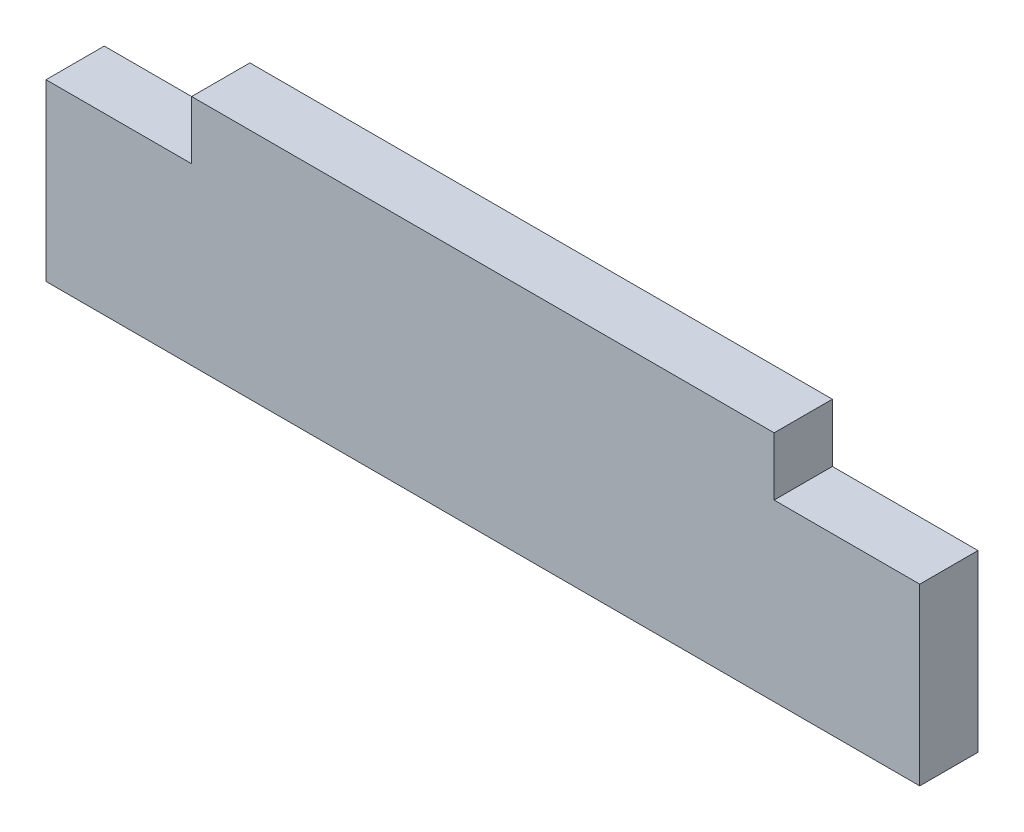
ISO-10303-21;
HEADER;
FILE_DESCRIPTION(('STEP AP214'),'2;1');
FILE_NAME('part.step','',(''),(''),'','','');
FILE_SCHEMA(('AUTOMOTIVE_DESIGN { 1 0 10303 214 1 1 1 1 }'));
ENDSEC;
DATA;
#1=APPLICATION_CONTEXT('core data for automotive mechanical design processes');
#2=APPLICATION_PROTOCOL_DEFINITION('international standard','automotive_design',2000,#1);
#3=PRODUCT_CONTEXT('',#1,'mechanical');
#4=PRODUCT('Part','Part','',(#3));
#5=PRODUCT_RELATED_PRODUCT_CATEGORY('part','',(#4));
#6=PRODUCT_DEFINITION_FORMATION('','',#4);
#7=PRODUCT_DEFINITION_CONTEXT('part definition',#1,'design');
#8=PRODUCT_DEFINITION('design','',#6,#7);
#9=PRODUCT_DEFINITION_SHAPE('','',#8);
#10=(LENGTH_UNIT() NAMED_UNIT(*) SI_UNIT(.MILLI.,.METRE.));
#11=(NAMED_UNIT(*) PLANE_ANGLE_UNIT() SI_UNIT($,.RADIAN.));
#12=(NAMED_UNIT(*) SI_UNIT($,.STERADIAN.) SOLID_ANGLE_UNIT());
#13=UNCERTAINTY_MEASURE_WITH_UNIT(LENGTH_MEASURE(1.E-05),#10,'distance_accuracy_value','');
#14=(GEOMETRIC_REPRESENTATION_CONTEXT(3) GLOBAL_UNCERTAINTY_ASSIGNED_CONTEXT((#13)) GLOBAL_UNIT_ASSIGNED_CONTEXT((#10,
#11,#12)) REPRESENTATION_CONTEXT('',''));
#15=CARTESIAN_POINT('',(0.,0.,0.));
#16=DIRECTION('',(0.,0.,1.));
#17=DIRECTION('',(1.,0.,0.));
#18=AXIS2_PLACEMENT_3D('',#15,#16,#17);
#19=CARTESIAN_POINT('',(22.5,0.,1.5));
#20=DIRECTION('',(0.,1.,0.));
#21=DIRECTION('',(-1.,0.,0.));
#22=AXIS2_PLACEMENT_3D('',#19,#20,#21);
#23=PLANE('',#22);
#24=DIRECTION('',(1.,0.,0.));
#25=VECTOR('',#24,1.);
#26=CARTESIAN_POINT('',(22.5,0.,-1.5));
#27=LINE('',#26,#25);
#28=CARTESIAN_POINT('',(-22.5,0.,-1.5));
#29=VERTEX_POINT('',#28);
#30=CARTESIAN_POINT('',(22.5,0.,-1.5));
#31=VERTEX_POINT('',#30);
#32=EDGE_CURVE('E140',#29,#31,#27,.T.);
#33=ORIENTED_EDGE('',*,*,#32,.T.);
#34=DIRECTION('',(0.,0.,-1.));
#35=VECTOR('',#34,1.);
#36=CARTESIAN_POINT('',(22.5,0.,1.5));
#37=LINE('',#36,#35);
#38=CARTESIAN_POINT('',(22.5,0.,1.5));
#39=VERTEX_POINT('',#38);
#40=EDGE_CURVE('E11',#39,#31,#37,.T.);
#41=ORIENTED_EDGE('',*,*,#40,.F.);
#42=DIRECTION('',(1.,0.,0.));
#43=VECTOR('',#42,1.);
#44=CARTESIAN_POINT('',(22.5,0.,1.5));
#45=LINE('',#44,#43);
#46=CARTESIAN_POINT('',(-22.5,0.,1.5));
#47=VERTEX_POINT('',#46);
#48=EDGE_CURVE('E162',#47,#39,#45,.T.);
#49=ORIENTED_EDGE('',*,*,#48,.F.);
#50=DIRECTION('',(0.,0.,-1.));
#51=VECTOR('',#50,1.);
#52=CARTESIAN_POINT('',(-22.5,0.,1.5));
#53=LINE('',#52,#51);
#54=EDGE_CURVE('E136',#47,#29,#53,.T.);
#55=ORIENTED_EDGE('',*,*,#54,.T.);
#56=EDGE_LOOP('',(#33,#41,#49,#55));
#57=FACE_BOUND('',#56,.T.);
#58=ADVANCED_FACE('F39',(#57),#23,.F.);
#59=CARTESIAN_POINT('',(22.5,9.,1.5));
#60=DIRECTION('',(-1.,0.,0.));
#61=DIRECTION('',(0.,0.,1.));
#62=AXIS2_PLACEMENT_3D('',#59,#60,#61);
#63=PLANE('',#62);
#64=DIRECTION('',(0.,1.,0.));
#65=VECTOR('',#64,1.);
#66=CARTESIAN_POINT('',(22.5,9.,-1.5));
#67=LINE('',#66,#65);
#68=CARTESIAN_POINT('',(22.5,9.,-1.5));
#69=VERTEX_POINT('',#68);
#70=EDGE_CURVE('E144',#31,#69,#67,.T.);
#71=ORIENTED_EDGE('',*,*,#70,.T.);
#72=DIRECTION('',(0.,0.,-1.));
#73=VECTOR('',#72,1.);
#74=CARTESIAN_POINT('',(22.5,9.,1.5));
#75=LINE('',#74,#73);
#76=CARTESIAN_POINT('',(22.5,9.,1.5));
#77=VERTEX_POINT('',#76);
#78=EDGE_CURVE('E48',#77,#69,#75,.T.);
#79=ORIENTED_EDGE('',*,*,#78,.F.);
#80=DIRECTION('',(0.,1.,0.));
#81=VECTOR('',#80,1.);
#82=CARTESIAN_POINT('',(22.5,9.,1.5));
#83=LINE('',#82,#81);
#84=EDGE_CURVE('E99',#39,#77,#83,.T.);
#85=ORIENTED_EDGE('',*,*,#84,.F.);
#86=ORIENTED_EDGE('',*,*,#40,.T.);
#87=EDGE_LOOP('',(#71,#79,#85,#86));
#88=FACE_BOUND('',#87,.T.);
#89=ADVANCED_FACE('F208',(#88),#63,.F.);
#90=CARTESIAN_POINT('',(15.,9.,1.5));
#91=DIRECTION('',(0.,-1.,0.));
#92=DIRECTION('',(0.,0.,-1.));
#93=AXIS2_PLACEMENT_3D('',#90,#91,#92);
#94=PLANE('',#93);
#95=DIRECTION('',(-1.,0.,0.));
#96=VECTOR('',#95,1.);
#97=CARTESIAN_POINT('',(15.,9.,-1.5));
#98=LINE('',#97,#96);
#99=CARTESIAN_POINT('',(15.,9.,-1.5));
#100=VERTEX_POINT('',#99);
#101=EDGE_CURVE('E147',#69,#100,#98,.T.);
#102=ORIENTED_EDGE('',*,*,#101,.T.);
#103=DIRECTION('',(0.,0.,-1.));
#104=VECTOR('',#103,1.);
#105=CARTESIAN_POINT('',(15.,9.,1.5));
#106=LINE('',#105,#104);
#107=CARTESIAN_POINT('',(15.,9.,1.5));
#108=VERTEX_POINT('',#107);
#109=EDGE_CURVE('E173',#108,#100,#106,.T.);
#110=ORIENTED_EDGE('',*,*,#109,.F.);
#111=DIRECTION('',(-1.,0.,0.));
#112=VECTOR('',#111,1.);
#113=CARTESIAN_POINT('',(15.,9.,1.5));
#114=LINE('',#113,#112);
#115=EDGE_CURVE('E183',#77,#108,#114,.T.);
#116=ORIENTED_EDGE('',*,*,#115,.F.);
#117=ORIENTED_EDGE('',*,*,#78,.T.);
#118=EDGE_LOOP('',(#102,#110,#116,#117));
#119=FACE_BOUND('',#118,.T.);
#120=ADVANCED_FACE('F181',(#119),#94,.F.);
#121=CARTESIAN_POINT('',(15.,12.,1.5));
#122=DIRECTION('',(-1.,0.,0.));
#123=DIRECTION('',(0.,0.,1.));
#124=AXIS2_PLACEMENT_3D('',#121,#122,#123);
#125=PLANE('',#124);
#126=DIRECTION('',(0.,1.,0.));
#127=VECTOR('',#126,1.);
#128=CARTESIAN_POINT('',(15.,12.,-1.5));
#129=LINE('',#128,#127);
#130=CARTESIAN_POINT('',(15.,12.,-1.5));
#131=VERTEX_POINT('',#130);
#132=EDGE_CURVE('E150',#100,#131,#129,.T.);
#133=ORIENTED_EDGE('',*,*,#132,.T.);
#134=DIRECTION('',(0.,0.,-1.));
#135=VECTOR('',#134,1.);
#136=CARTESIAN_POINT('',(15.,12.,1.5));
#137=LINE('',#136,#135);
#138=CARTESIAN_POINT('',(15.,12.,1.5));
#139=VERTEX_POINT('',#138);
#140=EDGE_CURVE('E169',#139,#131,#137,.T.);
#141=ORIENTED_EDGE('',*,*,#140,.F.);
#142=DIRECTION('',(0.,1.,0.));
#143=VECTOR('',#142,1.);
#144=CARTESIAN_POINT('',(15.,12.,1.5));
#145=LINE('',#144,#143);
#146=EDGE_CURVE('E196',#108,#139,#145,.T.);
#147=ORIENTED_EDGE('',*,*,#146,.F.);
#148=ORIENTED_EDGE('',*,*,#109,.T.);
#149=EDGE_LOOP('',(#133,#141,#147,#148));
#150=FACE_BOUND('',#149,.T.);
#151=ADVANCED_FACE('F191',(#150),#125,.F.);
#152=CARTESIAN_POINT('',(-15.,12.,1.5));
#153=DIRECTION('',(0.,-1.,0.));
#154=DIRECTION('',(0.,0.,-1.));
#155=AXIS2_PLACEMENT_3D('',#152,#153,#154);
#156=PLANE('',#155);
#157=DIRECTION('',(-1.,0.,0.));
#158=VECTOR('',#157,1.);
#159=CARTESIAN_POINT('',(-15.,12.,-1.5));
#160=LINE('',#159,#158);
#161=CARTESIAN_POINT('',(-15.,12.,-1.5));
#162=VERTEX_POINT('',#161);
#163=EDGE_CURVE('E153',#131,#162,#160,.T.);
#164=ORIENTED_EDGE('',*,*,#163,.T.);
#165=DIRECTION('',(0.,0.,-1.));
#166=VECTOR('',#165,1.);
#167=CARTESIAN_POINT('',(-15.,12.,1.5));
#168=LINE('',#167,#166);
#169=CARTESIAN_POINT('',(-15.,12.,1.5));
#170=VERTEX_POINT('',#169);
#171=EDGE_CURVE('E129',#170,#162,#168,.T.);
#172=ORIENTED_EDGE('',*,*,#171,.F.);
#173=DIRECTION('',(-1.,0.,0.));
#174=VECTOR('',#173,1.);
#175=CARTESIAN_POINT('',(-15.,12.,1.5));
#176=LINE('',#175,#174);
#177=EDGE_CURVE('E118',#139,#170,#176,.T.);
#178=ORIENTED_EDGE('',*,*,#177,.F.);
#179=ORIENTED_EDGE('',*,*,#140,.T.);
#180=EDGE_LOOP('',(#164,#172,#178,#179));
#181=FACE_BOUND('',#180,.T.);
#182=ADVANCED_FACE('F194',(#181),#156,.F.);
#183=CARTESIAN_POINT('',(-15.,9.,1.5));
#184=DIRECTION('',(1.,0.,0.));
#185=DIRECTION('',(0.,0.,-1.));
#186=AXIS2_PLACEMENT_3D('',#183,#184,#185);
#187=PLANE('',#186);
#188=DIRECTION('',(0.,-1.,0.));
#189=VECTOR('',#188,1.);
#190=CARTESIAN_POINT('',(-15.,9.,-1.5));
#191=LINE('',#190,#189);
#192=CARTESIAN_POINT('',(-15.,9.,-1.5));
#193=VERTEX_POINT('',#192);
#194=EDGE_CURVE('E127',#162,#193,#191,.T.);
#195=ORIENTED_EDGE('',*,*,#194,.T.);
#196=DIRECTION('',(0.,0.,-1.));
#197=VECTOR('',#196,1.);
#198=CARTESIAN_POINT('',(-15.,9.,1.5));
#199=LINE('',#198,#197);
#200=CARTESIAN_POINT('',(-15.,9.,1.5));
#201=VERTEX_POINT('',#200);
#202=EDGE_CURVE('E124',#201,#193,#199,.T.);
#203=ORIENTED_EDGE('',*,*,#202,.F.);
#204=DIRECTION('',(0.,-1.,0.));
#205=VECTOR('',#204,1.);
#206=CARTESIAN_POINT('',(-15.,9.,1.5));
#207=LINE('',#206,#205);
#208=EDGE_CURVE('E112',#170,#201,#207,.T.);
#209=ORIENTED_EDGE('',*,*,#208,.F.);
#210=ORIENTED_EDGE('',*,*,#171,.T.);
#211=EDGE_LOOP('',(#195,#203,#209,#210));
#212=FACE_BOUND('',#211,.T.);
#213=ADVANCED_FACE('F125',(#212),#187,.F.);
#214=CARTESIAN_POINT('',(-22.5,9.,1.5));
#215=DIRECTION('',(0.,-1.,0.));
#216=DIRECTION('',(1.,0.,0.));
#217=AXIS2_PLACEMENT_3D('',#214,#215,#216);
#218=PLANE('',#217);
#219=DIRECTION('',(-1.,0.,0.));
#220=VECTOR('',#219,1.);
#221=CARTESIAN_POINT('',(-22.5,9.,-1.5));
#222=LINE('',#221,#220);
#223=CARTESIAN_POINT('',(-22.5,9.,-1.5));
#224=VERTEX_POINT('',#223);
#225=EDGE_CURVE('E85',#193,#224,#222,.T.);
#226=ORIENTED_EDGE('',*,*,#225,.T.);
#227=DIRECTION('',(0.,0.,-1.));
#228=VECTOR('',#227,1.);
#229=CARTESIAN_POINT('',(-22.5,9.,1.5));
#230=LINE('',#229,#228);
#231=CARTESIAN_POINT('',(-22.5,9.,1.5));
#232=VERTEX_POINT('',#231);
#233=EDGE_CURVE('E130',#232,#224,#230,.T.);
#234=ORIENTED_EDGE('',*,*,#233,.F.);
#235=DIRECTION('',(-1.,0.,0.));
#236=VECTOR('',#235,1.);
#237=CARTESIAN_POINT('',(-22.5,9.,1.5));
#238=LINE('',#237,#236);
#239=EDGE_CURVE('E116',#201,#232,#238,.T.);
#240=ORIENTED_EDGE('',*,*,#239,.F.);
#241=ORIENTED_EDGE('',*,*,#202,.T.);
#242=EDGE_LOOP('',(#226,#234,#240,#241));
#243=FACE_BOUND('',#242,.T.);
#244=ADVANCED_FACE('F132',(#243),#218,.F.);
#245=CARTESIAN_POINT('',(-22.5,0.,1.5));
#246=DIRECTION('',(1.,0.,0.));
#247=DIRECTION('',(0.,0.,-1.));
#248=AXIS2_PLACEMENT_3D('',#245,#246,#247);
#249=PLANE('',#248);
#250=DIRECTION('',(0.,-1.,0.));
#251=VECTOR('',#250,1.);
#252=CARTESIAN_POINT('',(-22.5,0.,-1.5));
#253=LINE('',#252,#251);
#254=EDGE_CURVE('E91',#224,#29,#253,.T.);
#255=ORIENTED_EDGE('',*,*,#254,.T.);
#256=ORIENTED_EDGE('',*,*,#54,.F.);
#257=DIRECTION('',(0.,-1.,0.));
#258=VECTOR('',#257,1.);
#259=CARTESIAN_POINT('',(-22.5,0.,1.5));
#260=LINE('',#259,#258);
#261=EDGE_CURVE('E56',#232,#47,#260,.T.);
#262=ORIENTED_EDGE('',*,*,#261,.F.);
#263=ORIENTED_EDGE('',*,*,#233,.T.);
#264=EDGE_LOOP('',(#255,#256,#262,#263));
#265=FACE_BOUND('',#264,.T.);
#266=ADVANCED_FACE('F224',(#265),#249,.F.);
#267=CARTESIAN_POINT('',(0.,0.,1.5));
#268=DIRECTION('',(0.,0.,-1.));
#269=DIRECTION('',(-1.,0.,0.));
#270=AXIS2_PLACEMENT_3D('',#267,#268,#269);
#271=PLANE('',#270);
#272=ORIENTED_EDGE('',*,*,#48,.T.);
#273=ORIENTED_EDGE('',*,*,#84,.T.);
#274=ORIENTED_EDGE('',*,*,#115,.T.);
#275=ORIENTED_EDGE('',*,*,#146,.T.);
#276=ORIENTED_EDGE('',*,*,#177,.T.);
#277=ORIENTED_EDGE('',*,*,#208,.T.);
#278=ORIENTED_EDGE('',*,*,#239,.T.);
#279=ORIENTED_EDGE('',*,*,#261,.T.);
#280=EDGE_LOOP('',(#272,#273,#274,#275,#276,#277,#278,#279));
#281=FACE_BOUND('',#280,.T.);
#282=ADVANCED_FACE('F114',(#281),#271,.F.);
#283=CARTESIAN_POINT('',(0.,0.,-1.5));
#284=DIRECTION('',(0.,0.,-1.));
#285=DIRECTION('',(-1.,0.,0.));
#286=AXIS2_PLACEMENT_3D('',#283,#284,#285);
#287=PLANE('',#286);
#288=ORIENTED_EDGE('',*,*,#32,.F.);
#289=ORIENTED_EDGE('',*,*,#254,.F.);
#290=ORIENTED_EDGE('',*,*,#225,.F.);
#291=ORIENTED_EDGE('',*,*,#194,.F.);
#292=ORIENTED_EDGE('',*,*,#163,.F.);
#293=ORIENTED_EDGE('',*,*,#132,.F.);
#294=ORIENTED_EDGE('',*,*,#101,.F.);
#295=ORIENTED_EDGE('',*,*,#70,.F.);
#296=EDGE_LOOP('',(#288,#289,#290,#291,#292,#293,#294,#295));
#297=FACE_BOUND('',#296,.T.);
#298=ADVANCED_FACE('F187',(#297),#287,.T.);
#299=CLOSED_SHELL('',(#58,#89,#120,#151,#182,#213,#244,#266,#282,#298));
#300=MANIFOLD_SOLID_BREP('B2',#299);
#301=ADVANCED_BREP_SHAPE_REPRESENTATION('',(#18,#300),#14);
#302=SHAPE_DEFINITION_REPRESENTATION(#9,#301);
ENDSEC;
END-ISO-10303-21;
